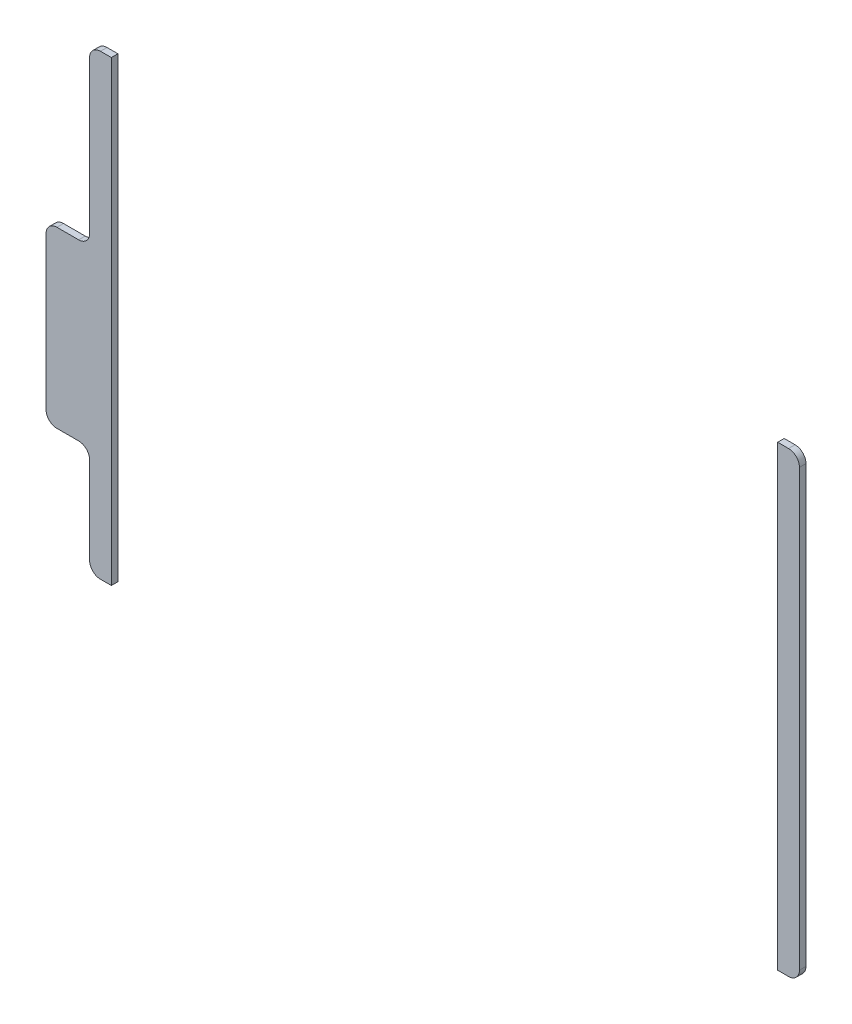
ISO-10303-21;
HEADER;
FILE_DESCRIPTION(('STEP AP214'),'2;1');
FILE_NAME('part.step','',(''),(''),'','','');
FILE_SCHEMA(('AUTOMOTIVE_DESIGN { 1 0 10303 214 1 1 1 1 }'));
ENDSEC;
DATA;
#1=APPLICATION_CONTEXT('core data for automotive mechanical design processes');
#2=APPLICATION_PROTOCOL_DEFINITION('international standard','automotive_design',2000,#1);
#3=PRODUCT_CONTEXT('',#1,'mechanical');
#4=PRODUCT('Part','Part','',(#3));
#5=PRODUCT_RELATED_PRODUCT_CATEGORY('part','',(#4));
#6=PRODUCT_DEFINITION_FORMATION('','',#4);
#7=PRODUCT_DEFINITION_CONTEXT('part definition',#1,'design');
#8=PRODUCT_DEFINITION('design','',#6,#7);
#9=PRODUCT_DEFINITION_SHAPE('','',#8);
#10=(LENGTH_UNIT() NAMED_UNIT(*) SI_UNIT(.MILLI.,.METRE.));
#11=(NAMED_UNIT(*) PLANE_ANGLE_UNIT() SI_UNIT($,.RADIAN.));
#12=(NAMED_UNIT(*) SI_UNIT($,.STERADIAN.) SOLID_ANGLE_UNIT());
#13=UNCERTAINTY_MEASURE_WITH_UNIT(LENGTH_MEASURE(1.E-05),#10,'distance_accuracy_value','');
#14=(GEOMETRIC_REPRESENTATION_CONTEXT(3) GLOBAL_UNCERTAINTY_ASSIGNED_CONTEXT((#13)) GLOBAL_UNIT_ASSIGNED_CONTEXT((#10,
#11,#12)) REPRESENTATION_CONTEXT('',''));
#15=CARTESIAN_POINT('',(0.,0.,0.));
#16=DIRECTION('',(0.,0.,1.));
#17=DIRECTION('',(1.,0.,0.));
#18=AXIS2_PLACEMENT_3D('',#15,#16,#17);
#19=CARTESIAN_POINT('',(-30.6,21.,0.6));
#20=DIRECTION('',(0.,-1.,0.));
#21=DIRECTION('',(0.,0.,-1.));
#22=AXIS2_PLACEMENT_3D('',#19,#20,#21);
#23=PLANE('',#22);
#24=DIRECTION('',(-1.,0.,0.));
#25=VECTOR('',#24,1.);
#26=CARTESIAN_POINT('',(-30.6,21.,0.));
#27=LINE('',#26,#25);
#28=CARTESIAN_POINT('',(-30.6,21.,0.));
#29=VERTEX_POINT('',#28);
#30=CARTESIAN_POINT('',(-31.6,21.,0.));
#31=VERTEX_POINT('',#30);
#32=EDGE_CURVE('E177',#29,#31,#27,.T.);
#33=ORIENTED_EDGE('',*,*,#32,.T.);
#34=DIRECTION('',(0.,0.,-1.));
#35=VECTOR('',#34,1.);
#36=CARTESIAN_POINT('',(-31.6,21.,0.6));
#37=LINE('',#36,#35);
#38=CARTESIAN_POINT('',(-31.6,21.,0.6));
#39=VERTEX_POINT('',#38);
#40=EDGE_CURVE('E12',#39,#31,#37,.T.);
#41=ORIENTED_EDGE('',*,*,#40,.F.);
#42=DIRECTION('',(-1.,0.,0.));
#43=VECTOR('',#42,1.);
#44=CARTESIAN_POINT('',(-30.6,21.,0.6));
#45=LINE('',#44,#43);
#46=CARTESIAN_POINT('',(-30.6,21.,0.6));
#47=VERTEX_POINT('',#46);
#48=EDGE_CURVE('E203',#47,#39,#45,.T.);
#49=ORIENTED_EDGE('',*,*,#48,.F.);
#50=DIRECTION('',(0.,0.,-1.));
#51=VECTOR('',#50,1.);
#52=CARTESIAN_POINT('',(-30.6,21.,0.6));
#53=LINE('',#52,#51);
#54=EDGE_CURVE('E173',#47,#29,#53,.T.);
#55=ORIENTED_EDGE('',*,*,#54,.T.);
#56=EDGE_LOOP('',(#33,#41,#49,#55));
#57=FACE_BOUND('',#56,.T.);
#58=ADVANCED_FACE('F45',(#57),#23,.F.);
#59=CARTESIAN_POINT('',(-31.6,20.,0.6));
#60=DIRECTION('',(0.,0.,-1.));
#61=DIRECTION('',(-1.,0.,0.));
#62=AXIS2_PLACEMENT_3D('',#59,#60,#61);
#63=CYLINDRICAL_SURFACE('',#62,1.);
#64=CARTESIAN_POINT('',(-31.6,20.,0.));
#65=DIRECTION('',(0.,0.,1.));
#66=DIRECTION('',(1.,0.,0.));
#67=AXIS2_PLACEMENT_3D('',#64,#65,#66);
#68=CIRCLE('',#67,1.);
#69=CARTESIAN_POINT('',(-32.6,20.,0.));
#70=VERTEX_POINT('',#69);
#71=EDGE_CURVE('E180',#31,#70,#68,.T.);
#72=ORIENTED_EDGE('',*,*,#71,.T.);
#73=DIRECTION('',(0.,0.,-1.));
#74=VECTOR('',#73,1.);
#75=CARTESIAN_POINT('',(-32.6,20.,0.6));
#76=LINE('',#75,#74);
#77=CARTESIAN_POINT('',(-32.6,20.,0.6));
#78=VERTEX_POINT('',#77);
#79=EDGE_CURVE('E53',#78,#70,#76,.T.);
#80=ORIENTED_EDGE('',*,*,#79,.F.);
#81=CARTESIAN_POINT('',(-31.6,20.,0.6));
#82=DIRECTION('',(0.,0.,1.));
#83=DIRECTION('',(1.,0.,0.));
#84=AXIS2_PLACEMENT_3D('',#81,#82,#83);
#85=CIRCLE('',#84,1.);
#86=EDGE_CURVE('E122',#39,#78,#85,.T.);
#87=ORIENTED_EDGE('',*,*,#86,.F.);
#88=ORIENTED_EDGE('',*,*,#40,.T.);
#89=EDGE_LOOP('',(#72,#80,#87,#88));
#90=FACE_BOUND('',#89,.T.);
#91=ADVANCED_FACE('F291',(#90),#63,.T.);
#92=CARTESIAN_POINT('',(-32.6,6.,0.6));
#93=DIRECTION('',(1.,0.,0.));
#94=DIRECTION('',(0.,0.,-1.));
#95=AXIS2_PLACEMENT_3D('',#92,#93,#94);
#96=PLANE('',#95);
#97=DIRECTION('',(0.,-1.,0.));
#98=VECTOR('',#97,1.);
#99=CARTESIAN_POINT('',(-32.6,6.,0.));
#100=LINE('',#99,#98);
#101=CARTESIAN_POINT('',(-32.6,6.,0.));
#102=VERTEX_POINT('',#101);
#103=EDGE_CURVE('E182',#70,#102,#100,.T.);
#104=ORIENTED_EDGE('',*,*,#103,.T.);
#105=DIRECTION('',(0.,0.,-1.));
#106=VECTOR('',#105,1.);
#107=CARTESIAN_POINT('',(-32.6,6.,0.6));
#108=LINE('',#107,#106);
#109=CARTESIAN_POINT('',(-32.6,6.,0.6));
#110=VERTEX_POINT('',#109);
#111=EDGE_CURVE('E228',#110,#102,#108,.T.);
#112=ORIENTED_EDGE('',*,*,#111,.F.);
#113=DIRECTION('',(0.,-1.,0.));
#114=VECTOR('',#113,1.);
#115=CARTESIAN_POINT('',(-32.6,6.,0.6));
#116=LINE('',#115,#114);
#117=EDGE_CURVE('E236',#78,#110,#116,.T.);
#118=ORIENTED_EDGE('',*,*,#117,.F.);
#119=ORIENTED_EDGE('',*,*,#79,.T.);
#120=EDGE_LOOP('',(#104,#112,#118,#119));
#121=FACE_BOUND('',#120,.T.);
#122=ADVANCED_FACE('F234',(#121),#96,.F.);
#123=CARTESIAN_POINT('',(-33.6,6.,0.6));
#124=DIRECTION('',(0.,0.,-1.));
#125=DIRECTION('',(-1.,0.,0.));
#126=AXIS2_PLACEMENT_3D('',#123,#124,#125);
#127=CYLINDRICAL_SURFACE('',#126,1.);
#128=CARTESIAN_POINT('',(-33.6,6.,0.));
#129=DIRECTION('',(0.,0.,-1.));
#130=DIRECTION('',(1.,0.,0.));
#131=AXIS2_PLACEMENT_3D('',#128,#129,#130);
#132=CIRCLE('',#131,1.);
#133=CARTESIAN_POINT('',(-33.6,5.,0.));
#134=VERTEX_POINT('',#133);
#135=EDGE_CURVE('E184',#102,#134,#132,.T.);
#136=ORIENTED_EDGE('',*,*,#135,.T.);
#137=DIRECTION('',(0.,0.,-1.));
#138=VECTOR('',#137,1.);
#139=CARTESIAN_POINT('',(-33.6,5.,0.6));
#140=LINE('',#139,#138);
#141=CARTESIAN_POINT('',(-33.6,5.,0.6));
#142=VERTEX_POINT('',#141);
#143=EDGE_CURVE('E225',#142,#134,#140,.T.);
#144=ORIENTED_EDGE('',*,*,#143,.F.);
#145=CARTESIAN_POINT('',(-33.6,6.,0.6));
#146=DIRECTION('',(0.,0.,-1.));
#147=DIRECTION('',(1.,0.,0.));
#148=AXIS2_PLACEMENT_3D('',#145,#146,#147);
#149=CIRCLE('',#148,1.);
#150=EDGE_CURVE('E254',#110,#142,#149,.T.);
#151=ORIENTED_EDGE('',*,*,#150,.F.);
#152=ORIENTED_EDGE('',*,*,#111,.T.);
#153=EDGE_LOOP('',(#136,#144,#151,#152));
#154=FACE_BOUND('',#153,.T.);
#155=ADVANCED_FACE('F245',(#154),#127,.F.);
#156=CARTESIAN_POINT('',(-35.6,5.,0.6));
#157=DIRECTION('',(0.,-1.,0.));
#158=DIRECTION('',(0.,0.,-1.));
#159=AXIS2_PLACEMENT_3D('',#156,#157,#158);
#160=PLANE('',#159);
#161=DIRECTION('',(-1.,0.,0.));
#162=VECTOR('',#161,1.);
#163=CARTESIAN_POINT('',(-35.6,5.,0.));
#164=LINE('',#163,#162);
#165=CARTESIAN_POINT('',(-35.6,5.,0.));
#166=VERTEX_POINT('',#165);
#167=EDGE_CURVE('E186',#134,#166,#164,.T.);
#168=ORIENTED_EDGE('',*,*,#167,.T.);
#169=DIRECTION('',(0.,0.,-1.));
#170=VECTOR('',#169,1.);
#171=CARTESIAN_POINT('',(-35.6,5.,0.6));
#172=LINE('',#171,#170);
#173=CARTESIAN_POINT('',(-35.6,5.,0.6));
#174=VERTEX_POINT('',#173);
#175=EDGE_CURVE('E222',#174,#166,#172,.T.);
#176=ORIENTED_EDGE('',*,*,#175,.F.);
#177=DIRECTION('',(-1.,0.,0.));
#178=VECTOR('',#177,1.);
#179=CARTESIAN_POINT('',(-35.6,5.,0.6));
#180=LINE('',#179,#178);
#181=EDGE_CURVE('E251',#142,#174,#180,.T.);
#182=ORIENTED_EDGE('',*,*,#181,.F.);
#183=ORIENTED_EDGE('',*,*,#143,.T.);
#184=EDGE_LOOP('',(#168,#176,#182,#183));
#185=FACE_BOUND('',#184,.T.);
#186=ADVANCED_FACE('F249',(#185),#160,.F.);
#187=CARTESIAN_POINT('',(-35.6,4.,0.6));
#188=DIRECTION('',(0.,0.,-1.));
#189=DIRECTION('',(-1.,0.,0.));
#190=AXIS2_PLACEMENT_3D('',#187,#188,#189);
#191=CYLINDRICAL_SURFACE('',#190,1.);
#192=CARTESIAN_POINT('',(-35.6,4.,0.));
#193=DIRECTION('',(0.,0.,1.));
#194=DIRECTION('',(-1.,0.,0.));
#195=AXIS2_PLACEMENT_3D('',#192,#193,#194);
#196=CIRCLE('',#195,1.);
#197=CARTESIAN_POINT('',(-36.6,3.99999999999999,0.));
#198=VERTEX_POINT('',#197);
#199=EDGE_CURVE('E188',#166,#198,#196,.T.);
#200=ORIENTED_EDGE('',*,*,#199,.T.);
#201=DIRECTION('',(0.,0.,-1.));
#202=VECTOR('',#201,1.);
#203=CARTESIAN_POINT('',(-36.6,3.99999999999999,0.6));
#204=LINE('',#203,#202);
#205=CARTESIAN_POINT('',(-36.6,3.99999999999999,0.6));
#206=VERTEX_POINT('',#205);
#207=EDGE_CURVE('E219',#206,#198,#204,.T.);
#208=ORIENTED_EDGE('',*,*,#207,.F.);
#209=CARTESIAN_POINT('',(-35.6,4.,0.6));
#210=DIRECTION('',(0.,0.,1.));
#211=DIRECTION('',(-1.,0.,0.));
#212=AXIS2_PLACEMENT_3D('',#209,#210,#211);
#213=CIRCLE('',#212,1.);
#214=EDGE_CURVE('E253',#174,#206,#213,.T.);
#215=ORIENTED_EDGE('',*,*,#214,.F.);
#216=ORIENTED_EDGE('',*,*,#175,.T.);
#217=EDGE_LOOP('',(#200,#208,#215,#216));
#218=FACE_BOUND('',#217,.T.);
#219=ADVANCED_FACE('F304',(#218),#191,.T.);
#220=CARTESIAN_POINT('',(-36.6,-9.99999999999999,0.6));
#221=DIRECTION('',(1.,0.,0.));
#222=DIRECTION('',(0.,0.,-1.));
#223=AXIS2_PLACEMENT_3D('',#220,#221,#222);
#224=PLANE('',#223);
#225=DIRECTION('',(0.,-1.,0.));
#226=VECTOR('',#225,1.);
#227=CARTESIAN_POINT('',(-36.6,-9.99999999999999,0.));
#228=LINE('',#227,#226);
#229=CARTESIAN_POINT('',(-36.6,-10.,0.));
#230=VERTEX_POINT('',#229);
#231=EDGE_CURVE('E190',#198,#230,#228,.T.);
#232=ORIENTED_EDGE('',*,*,#231,.T.);
#233=DIRECTION('',(0.,0.,-1.));
#234=VECTOR('',#233,1.);
#235=CARTESIAN_POINT('',(-36.6,-10.,0.6));
#236=LINE('',#235,#234);
#237=CARTESIAN_POINT('',(-36.6,-10.,0.6));
#238=VERTEX_POINT('',#237);
#239=EDGE_CURVE('E216',#238,#230,#236,.T.);
#240=ORIENTED_EDGE('',*,*,#239,.F.);
#241=DIRECTION('',(0.,-1.,0.));
#242=VECTOR('',#241,1.);
#243=CARTESIAN_POINT('',(-36.6,-9.99999999999999,0.6));
#244=LINE('',#243,#242);
#245=EDGE_CURVE('E256',#206,#238,#244,.T.);
#246=ORIENTED_EDGE('',*,*,#245,.F.);
#247=ORIENTED_EDGE('',*,*,#207,.T.);
#248=EDGE_LOOP('',(#232,#240,#246,#247));
#249=FACE_BOUND('',#248,.T.);
#250=ADVANCED_FACE('F307',(#249),#224,.F.);
#251=CARTESIAN_POINT('',(-35.6,-10.,0.6));
#252=DIRECTION('',(0.,0.,-1.));
#253=DIRECTION('',(-1.,0.,0.));
#254=AXIS2_PLACEMENT_3D('',#251,#252,#253);
#255=CYLINDRICAL_SURFACE('',#254,1.);
#256=CARTESIAN_POINT('',(-35.6,-10.,0.));
#257=DIRECTION('',(0.,0.,1.));
#258=DIRECTION('',(-1.,0.,0.));
#259=AXIS2_PLACEMENT_3D('',#256,#257,#258);
#260=CIRCLE('',#259,1.);
#261=CARTESIAN_POINT('',(-35.6,-11.,0.));
#262=VERTEX_POINT('',#261);
#263=EDGE_CURVE('E192',#230,#262,#260,.T.);
#264=ORIENTED_EDGE('',*,*,#263,.T.);
#265=DIRECTION('',(0.,0.,-1.));
#266=VECTOR('',#265,1.);
#267=CARTESIAN_POINT('',(-35.6,-11.,0.6));
#268=LINE('',#267,#266);
#269=CARTESIAN_POINT('',(-35.6,-11.,0.6));
#270=VERTEX_POINT('',#269);
#271=EDGE_CURVE('E213',#270,#262,#268,.T.);
#272=ORIENTED_EDGE('',*,*,#271,.F.);
#273=CARTESIAN_POINT('',(-35.6,-10.,0.6));
#274=DIRECTION('',(0.,0.,1.));
#275=DIRECTION('',(-1.,0.,0.));
#276=AXIS2_PLACEMENT_3D('',#273,#274,#275);
#277=CIRCLE('',#276,1.);
#278=EDGE_CURVE('E262',#238,#270,#277,.T.);
#279=ORIENTED_EDGE('',*,*,#278,.F.);
#280=ORIENTED_EDGE('',*,*,#239,.T.);
#281=EDGE_LOOP('',(#264,#272,#279,#280));
#282=FACE_BOUND('',#281,.T.);
#283=ADVANCED_FACE('F311',(#282),#255,.T.);
#284=CARTESIAN_POINT('',(-33.6,-11.,0.6));
#285=DIRECTION('',(0.,1.,0.));
#286=DIRECTION('',(0.,0.,1.));
#287=AXIS2_PLACEMENT_3D('',#284,#285,#286);
#288=PLANE('',#287);
#289=DIRECTION('',(1.,0.,0.));
#290=VECTOR('',#289,1.);
#291=CARTESIAN_POINT('',(-33.6,-11.,0.));
#292=LINE('',#291,#290);
#293=CARTESIAN_POINT('',(-33.6,-11.,0.));
#294=VERTEX_POINT('',#293);
#295=EDGE_CURVE('E194',#262,#294,#292,.T.);
#296=ORIENTED_EDGE('',*,*,#295,.T.);
#297=DIRECTION('',(0.,0.,-1.));
#298=VECTOR('',#297,1.);
#299=CARTESIAN_POINT('',(-33.6,-11.,0.6));
#300=LINE('',#299,#298);
#301=CARTESIAN_POINT('',(-33.6,-11.,0.6));
#302=VERTEX_POINT('',#301);
#303=EDGE_CURVE('E210',#302,#294,#300,.T.);
#304=ORIENTED_EDGE('',*,*,#303,.F.);
#305=DIRECTION('',(1.,0.,0.));
#306=VECTOR('',#305,1.);
#307=CARTESIAN_POINT('',(-33.6,-11.,0.6));
#308=LINE('',#307,#306);
#309=EDGE_CURVE('E264',#270,#302,#308,.T.);
#310=ORIENTED_EDGE('',*,*,#309,.F.);
#311=ORIENTED_EDGE('',*,*,#271,.T.);
#312=EDGE_LOOP('',(#296,#304,#310,#311));
#313=FACE_BOUND('',#312,.T.);
#314=ADVANCED_FACE('F315',(#313),#288,.F.);
#315=CARTESIAN_POINT('',(-33.6,-12.,0.6));
#316=DIRECTION('',(0.,0.,-1.));
#317=DIRECTION('',(-1.,0.,0.));
#318=AXIS2_PLACEMENT_3D('',#315,#316,#317);
#319=CYLINDRICAL_SURFACE('',#318,1.);
#320=CARTESIAN_POINT('',(-33.6,-12.,0.));
#321=DIRECTION('',(0.,0.,-1.));
#322=DIRECTION('',(1.,0.,0.));
#323=AXIS2_PLACEMENT_3D('',#320,#321,#322);
#324=CIRCLE('',#323,1.);
#325=CARTESIAN_POINT('',(-32.6,-12.,0.));
#326=VERTEX_POINT('',#325);
#327=EDGE_CURVE('E196',#294,#326,#324,.T.);
#328=ORIENTED_EDGE('',*,*,#327,.T.);
#329=DIRECTION('',(0.,0.,-1.));
#330=VECTOR('',#329,1.);
#331=CARTESIAN_POINT('',(-32.6,-12.,0.6));
#332=LINE('',#331,#330);
#333=CARTESIAN_POINT('',(-32.6,-12.,0.6));
#334=VERTEX_POINT('',#333);
#335=EDGE_CURVE('E207',#334,#326,#332,.T.);
#336=ORIENTED_EDGE('',*,*,#335,.F.);
#337=CARTESIAN_POINT('',(-33.6,-12.,0.6));
#338=DIRECTION('',(0.,0.,-1.));
#339=DIRECTION('',(1.,0.,0.));
#340=AXIS2_PLACEMENT_3D('',#337,#338,#339);
#341=CIRCLE('',#340,1.);
#342=EDGE_CURVE('E266',#302,#334,#341,.T.);
#343=ORIENTED_EDGE('',*,*,#342,.F.);
#344=ORIENTED_EDGE('',*,*,#303,.T.);
#345=EDGE_LOOP('',(#328,#336,#343,#344));
#346=FACE_BOUND('',#345,.T.);
#347=ADVANCED_FACE('F272',(#346),#319,.F.);
#348=CARTESIAN_POINT('',(-32.6,-20.,0.6));
#349=DIRECTION('',(1.,0.,0.));
#350=DIRECTION('',(0.,0.,-1.));
#351=AXIS2_PLACEMENT_3D('',#348,#349,#350);
#352=PLANE('',#351);
#353=DIRECTION('',(0.,-1.,0.));
#354=VECTOR('',#353,1.);
#355=CARTESIAN_POINT('',(-32.6,-20.,0.));
#356=LINE('',#355,#354);
#357=CARTESIAN_POINT('',(-32.6,-20.,0.));
#358=VERTEX_POINT('',#357);
#359=EDGE_CURVE('E198',#326,#358,#356,.T.);
#360=ORIENTED_EDGE('',*,*,#359,.T.);
#361=DIRECTION('',(0.,0.,-1.));
#362=VECTOR('',#361,1.);
#363=CARTESIAN_POINT('',(-32.6,-20.,0.6));
#364=LINE('',#363,#362);
#365=CARTESIAN_POINT('',(-32.6,-20.,0.6));
#366=VERTEX_POINT('',#365);
#367=EDGE_CURVE('E168',#366,#358,#364,.T.);
#368=ORIENTED_EDGE('',*,*,#367,.F.);
#369=DIRECTION('',(0.,-1.,0.));
#370=VECTOR('',#369,1.);
#371=CARTESIAN_POINT('',(-32.6,-20.,0.6));
#372=LINE('',#371,#370);
#373=EDGE_CURVE('E159',#334,#366,#372,.T.);
#374=ORIENTED_EDGE('',*,*,#373,.F.);
#375=ORIENTED_EDGE('',*,*,#335,.T.);
#376=EDGE_LOOP('',(#360,#368,#374,#375));
#377=FACE_BOUND('',#376,.T.);
#378=ADVANCED_FACE('F276',(#377),#352,.F.);
#379=CARTESIAN_POINT('',(-31.6,-20.,0.6));
#380=DIRECTION('',(0.,0.,-1.));
#381=DIRECTION('',(-1.,0.,0.));
#382=AXIS2_PLACEMENT_3D('',#379,#380,#381);
#383=CYLINDRICAL_SURFACE('',#382,1.);
#384=CARTESIAN_POINT('',(-31.6,-20.,0.));
#385=DIRECTION('',(0.,0.,1.));
#386=DIRECTION('',(-1.,0.,0.));
#387=AXIS2_PLACEMENT_3D('',#384,#385,#386);
#388=CIRCLE('',#387,1.);
#389=CARTESIAN_POINT('',(-31.6,-21.,0.));
#390=VERTEX_POINT('',#389);
#391=EDGE_CURVE('E167',#358,#390,#388,.T.);
#392=ORIENTED_EDGE('',*,*,#391,.T.);
#393=DIRECTION('',(0.,0.,-1.));
#394=VECTOR('',#393,1.);
#395=CARTESIAN_POINT('',(-31.6,-21.,0.6));
#396=LINE('',#395,#394);
#397=CARTESIAN_POINT('',(-31.6,-21.,0.6));
#398=VERTEX_POINT('',#397);
#399=EDGE_CURVE('E164',#398,#390,#396,.T.);
#400=ORIENTED_EDGE('',*,*,#399,.F.);
#401=CARTESIAN_POINT('',(-31.6,-20.,0.6));
#402=DIRECTION('',(0.,0.,1.));
#403=DIRECTION('',(-1.,0.,0.));
#404=AXIS2_PLACEMENT_3D('',#401,#402,#403);
#405=CIRCLE('',#404,1.);
#406=EDGE_CURVE('E153',#366,#398,#405,.T.);
#407=ORIENTED_EDGE('',*,*,#406,.F.);
#408=ORIENTED_EDGE('',*,*,#367,.T.);
#409=EDGE_LOOP('',(#392,#400,#407,#408));
#410=FACE_BOUND('',#409,.T.);
#411=ADVANCED_FACE('F165',(#410),#383,.T.);
#412=CARTESIAN_POINT('',(-30.6,-21.,0.6));
#413=DIRECTION('',(0.,1.,0.));
#414=DIRECTION('',(0.,0.,1.));
#415=AXIS2_PLACEMENT_3D('',#412,#413,#414);
#416=PLANE('',#415);
#417=DIRECTION('',(1.,0.,0.));
#418=VECTOR('',#417,1.);
#419=CARTESIAN_POINT('',(-30.6,-21.,0.));
#420=LINE('',#419,#418);
#421=CARTESIAN_POINT('',(-30.6,-21.,0.));
#422=VERTEX_POINT('',#421);
#423=EDGE_CURVE('E108',#390,#422,#420,.T.);
#424=ORIENTED_EDGE('',*,*,#423,.T.);
#425=DIRECTION('',(0.,0.,-1.));
#426=VECTOR('',#425,1.);
#427=CARTESIAN_POINT('',(-30.6,-21.,0.6));
#428=LINE('',#427,#426);
#429=CARTESIAN_POINT('',(-30.6,-21.,0.6));
#430=VERTEX_POINT('',#429);
#431=EDGE_CURVE('E169',#430,#422,#428,.T.);
#432=ORIENTED_EDGE('',*,*,#431,.F.);
#433=DIRECTION('',(1.,0.,0.));
#434=VECTOR('',#433,1.);
#435=CARTESIAN_POINT('',(-30.6,-21.,0.6));
#436=LINE('',#435,#434);
#437=EDGE_CURVE('E157',#398,#430,#436,.T.);
#438=ORIENTED_EDGE('',*,*,#437,.F.);
#439=ORIENTED_EDGE('',*,*,#399,.T.);
#440=EDGE_LOOP('',(#424,#432,#438,#439));
#441=FACE_BOUND('',#440,.T.);
#442=ADVANCED_FACE('F171',(#441),#416,.F.);
#443=CARTESIAN_POINT('',(-30.6,21.,0.6));
#444=DIRECTION('',(-1.,0.,0.));
#445=DIRECTION('',(0.,-1.,0.));
#446=AXIS2_PLACEMENT_3D('',#443,#444,#445);
#447=PLANE('',#446);
#448=DIRECTION('',(0.,1.,0.));
#449=VECTOR('',#448,1.);
#450=CARTESIAN_POINT('',(-30.6,21.,0.));
#451=LINE('',#450,#449);
#452=EDGE_CURVE('E114',#422,#29,#451,.T.);
#453=ORIENTED_EDGE('',*,*,#452,.T.);
#454=ORIENTED_EDGE('',*,*,#54,.F.);
#455=DIRECTION('',(0.,1.,0.));
#456=VECTOR('',#455,1.);
#457=CARTESIAN_POINT('',(-30.6,21.,0.6));
#458=LINE('',#457,#456);
#459=EDGE_CURVE('E61',#430,#47,#458,.T.);
#460=ORIENTED_EDGE('',*,*,#459,.F.);
#461=ORIENTED_EDGE('',*,*,#431,.T.);
#462=EDGE_LOOP('',(#453,#454,#460,#461));
#463=FACE_BOUND('',#462,.T.);
#464=ADVANCED_FACE('F280',(#463),#447,.F.);
#465=CARTESIAN_POINT('',(-31.6,20.,0.6));
#466=DIRECTION('',(0.,0.,1.));
#467=DIRECTION('',(1.,0.,0.));
#468=AXIS2_PLACEMENT_3D('',#465,#466,#467);
#469=PLANE('',#468);
#470=ORIENTED_EDGE('',*,*,#48,.T.);
#471=ORIENTED_EDGE('',*,*,#86,.T.);
#472=ORIENTED_EDGE('',*,*,#117,.T.);
#473=ORIENTED_EDGE('',*,*,#150,.T.);
#474=ORIENTED_EDGE('',*,*,#181,.T.);
#475=ORIENTED_EDGE('',*,*,#214,.T.);
#476=ORIENTED_EDGE('',*,*,#245,.T.);
#477=ORIENTED_EDGE('',*,*,#278,.T.);
#478=ORIENTED_EDGE('',*,*,#309,.T.);
#479=ORIENTED_EDGE('',*,*,#342,.T.);
#480=ORIENTED_EDGE('',*,*,#373,.T.);
#481=ORIENTED_EDGE('',*,*,#406,.T.);
#482=ORIENTED_EDGE('',*,*,#437,.T.);
#483=ORIENTED_EDGE('',*,*,#459,.T.);
#484=EDGE_LOOP('',(#470,#471,#472,#473,#474,#475,#476,#477,#478,#479,#480,#481,#482,#483));
#485=FACE_BOUND('',#484,.T.);
#486=ADVANCED_FACE('F155',(#485),#469,.T.);
#487=CARTESIAN_POINT('',(-31.6,20.,0.));
#488=DIRECTION('',(0.,0.,1.));
#489=DIRECTION('',(1.,0.,0.));
#490=AXIS2_PLACEMENT_3D('',#487,#488,#489);
#491=PLANE('',#490);
#492=ORIENTED_EDGE('',*,*,#32,.F.);
#493=ORIENTED_EDGE('',*,*,#452,.F.);
#494=ORIENTED_EDGE('',*,*,#423,.F.);
#495=ORIENTED_EDGE('',*,*,#391,.F.);
#496=ORIENTED_EDGE('',*,*,#359,.F.);
#497=ORIENTED_EDGE('',*,*,#327,.F.);
#498=ORIENTED_EDGE('',*,*,#295,.F.);
#499=ORIENTED_EDGE('',*,*,#263,.F.);
#500=ORIENTED_EDGE('',*,*,#231,.F.);
#501=ORIENTED_EDGE('',*,*,#199,.F.);
#502=ORIENTED_EDGE('',*,*,#167,.F.);
#503=ORIENTED_EDGE('',*,*,#135,.F.);
#504=ORIENTED_EDGE('',*,*,#103,.F.);
#505=ORIENTED_EDGE('',*,*,#71,.F.);
#506=EDGE_LOOP('',(#492,#493,#494,#495,#496,#497,#498,#499,#500,#501,#502,#503,#504,#505));
#507=FACE_BOUND('',#506,.T.);
#508=ADVANCED_FACE('F240',(#507),#491,.F.);
#509=CLOSED_SHELL('',(#58,#91,#122,#155,#186,#219,#250,#283,#314,#347,#378,#411,#442,#464,#486,#508));
#510=MANIFOLD_SOLID_BREP('B2',#509);
#511=CARTESIAN_POINT('',(30.6,-21.,0.6));
#512=DIRECTION('',(0.,1.,0.));
#513=DIRECTION('',(0.,0.,1.));
#514=AXIS2_PLACEMENT_3D('',#511,#512,#513);
#515=PLANE('',#514);
#516=DIRECTION('',(1.,0.,0.));
#517=VECTOR('',#516,1.);
#518=CARTESIAN_POINT('',(30.6,-21.,0.));
#519=LINE('',#518,#517);
#520=CARTESIAN_POINT('',(30.6,-21.,0.));
#521=VERTEX_POINT('',#520);
#522=CARTESIAN_POINT('',(31.6,-21.,0.));
#523=VERTEX_POINT('',#522);
#524=EDGE_CURVE('E513',#521,#523,#519,.T.);
#525=ORIENTED_EDGE('',*,*,#524,.T.);
#526=DIRECTION('',(0.,0.,-1.));
#527=VECTOR('',#526,1.);
#528=CARTESIAN_POINT('',(31.6,-21.,0.6));
#529=LINE('',#528,#527);
#530=CARTESIAN_POINT('',(31.6,-21.,0.6));
#531=VERTEX_POINT('',#530);
#532=EDGE_CURVE('E43',#531,#523,#529,.T.);
#533=ORIENTED_EDGE('',*,*,#532,.F.);
#534=DIRECTION('',(1.,0.,0.));
#535=VECTOR('',#534,1.);
#536=CARTESIAN_POINT('',(30.6,-21.,0.6));
#537=LINE('',#536,#535);
#538=CARTESIAN_POINT('',(30.6,-21.,0.6));
#539=VERTEX_POINT('',#538);
#540=EDGE_CURVE('E523',#539,#531,#537,.T.);
#541=ORIENTED_EDGE('',*,*,#540,.F.);
#542=DIRECTION('',(0.,0.,-1.));
#543=VECTOR('',#542,1.);
#544=CARTESIAN_POINT('',(30.6,-21.,0.6));
#545=LINE('',#544,#543);
#546=EDGE_CURVE('E509',#539,#521,#545,.T.);
#547=ORIENTED_EDGE('',*,*,#546,.T.);
#548=EDGE_LOOP('',(#525,#533,#541,#547));
#549=FACE_BOUND('',#548,.T.);
#550=ADVANCED_FACE('F429',(#549),#515,.F.);
#551=CARTESIAN_POINT('',(31.6,-20.,0.6));
#552=DIRECTION('',(0.,0.,-1.));
#553=DIRECTION('',(-1.,0.,0.));
#554=AXIS2_PLACEMENT_3D('',#551,#552,#553);
#555=CYLINDRICAL_SURFACE('',#554,1.);
#556=CARTESIAN_POINT('',(31.6,-20.,0.));
#557=DIRECTION('',(0.,0.,1.));
#558=DIRECTION('',(1.,0.,0.));
#559=AXIS2_PLACEMENT_3D('',#556,#557,#558);
#560=CIRCLE('',#559,1.);
#561=CARTESIAN_POINT('',(32.6,-20.,0.));
#562=VERTEX_POINT('',#561);
#563=EDGE_CURVE('E516',#523,#562,#560,.T.);
#564=ORIENTED_EDGE('',*,*,#563,.T.);
#565=DIRECTION('',(0.,0.,-1.));
#566=VECTOR('',#565,1.);
#567=CARTESIAN_POINT('',(32.6,-20.,0.6));
#568=LINE('',#567,#566);
#569=CARTESIAN_POINT('',(32.6,-20.,0.6));
#570=VERTEX_POINT('',#569);
#571=EDGE_CURVE('E437',#570,#562,#568,.T.);
#572=ORIENTED_EDGE('',*,*,#571,.F.);
#573=CARTESIAN_POINT('',(31.6,-20.,0.6));
#574=DIRECTION('',(0.,0.,1.));
#575=DIRECTION('',(1.,0.,0.));
#576=AXIS2_PLACEMENT_3D('',#573,#574,#575);
#577=CIRCLE('',#576,1.);
#578=EDGE_CURVE('E482',#531,#570,#577,.T.);
#579=ORIENTED_EDGE('',*,*,#578,.F.);
#580=ORIENTED_EDGE('',*,*,#532,.T.);
#581=EDGE_LOOP('',(#564,#572,#579,#580));
#582=FACE_BOUND('',#581,.T.);
#583=ADVANCED_FACE('F547',(#582),#555,.T.);
#584=CARTESIAN_POINT('',(32.6,20.,0.6));
#585=DIRECTION('',(-1.,0.,0.));
#586=DIRECTION('',(0.,0.,1.));
#587=AXIS2_PLACEMENT_3D('',#584,#585,#586);
#588=PLANE('',#587);
#589=DIRECTION('',(0.,1.,0.));
#590=VECTOR('',#589,1.);
#591=CARTESIAN_POINT('',(32.6,20.,0.));
#592=LINE('',#591,#590);
#593=CARTESIAN_POINT('',(32.6,20.,0.));
#594=VERTEX_POINT('',#593);
#595=EDGE_CURVE('E518',#562,#594,#592,.T.);
#596=ORIENTED_EDGE('',*,*,#595,.T.);
#597=DIRECTION('',(0.,0.,-1.));
#598=VECTOR('',#597,1.);
#599=CARTESIAN_POINT('',(32.6,20.,0.6));
#600=LINE('',#599,#598);
#601=CARTESIAN_POINT('',(32.6,20.,0.6));
#602=VERTEX_POINT('',#601);
#603=EDGE_CURVE('E504',#602,#594,#600,.T.);
#604=ORIENTED_EDGE('',*,*,#603,.F.);
#605=DIRECTION('',(0.,1.,0.));
#606=VECTOR('',#605,1.);
#607=CARTESIAN_POINT('',(32.6,20.,0.6));
#608=LINE('',#607,#606);
#609=EDGE_CURVE('E495',#570,#602,#608,.T.);
#610=ORIENTED_EDGE('',*,*,#609,.F.);
#611=ORIENTED_EDGE('',*,*,#571,.T.);
#612=EDGE_LOOP('',(#596,#604,#610,#611));
#613=FACE_BOUND('',#612,.T.);
#614=ADVANCED_FACE('F529',(#613),#588,.F.);
#615=CARTESIAN_POINT('',(31.6,20.,0.6));
#616=DIRECTION('',(0.,0.,-1.));
#617=DIRECTION('',(-1.,0.,0.));
#618=AXIS2_PLACEMENT_3D('',#615,#616,#617);
#619=CYLINDRICAL_SURFACE('',#618,1.);
#620=CARTESIAN_POINT('',(31.6,20.,0.));
#621=DIRECTION('',(0.,0.,1.));
#622=DIRECTION('',(-1.,0.,0.));
#623=AXIS2_PLACEMENT_3D('',#620,#621,#622);
#624=CIRCLE('',#623,1.);
#625=CARTESIAN_POINT('',(31.6,21.,0.));
#626=VERTEX_POINT('',#625);
#627=EDGE_CURVE('E503',#594,#626,#624,.T.);
#628=ORIENTED_EDGE('',*,*,#627,.T.);
#629=DIRECTION('',(0.,0.,-1.));
#630=VECTOR('',#629,1.);
#631=CARTESIAN_POINT('',(31.6,21.,0.6));
#632=LINE('',#631,#630);
#633=CARTESIAN_POINT('',(31.6,21.,0.6));
#634=VERTEX_POINT('',#633);
#635=EDGE_CURVE('E500',#634,#626,#632,.T.);
#636=ORIENTED_EDGE('',*,*,#635,.F.);
#637=CARTESIAN_POINT('',(31.6,20.,0.6));
#638=DIRECTION('',(0.,0.,1.));
#639=DIRECTION('',(-1.,0.,0.));
#640=AXIS2_PLACEMENT_3D('',#637,#638,#639);
#641=CIRCLE('',#640,1.);
#642=EDGE_CURVE('E489',#602,#634,#641,.T.);
#643=ORIENTED_EDGE('',*,*,#642,.F.);
#644=ORIENTED_EDGE('',*,*,#603,.T.);
#645=EDGE_LOOP('',(#628,#636,#643,#644));
#646=FACE_BOUND('',#645,.T.);
#647=ADVANCED_FACE('F501',(#646),#619,.T.);
#648=CARTESIAN_POINT('',(30.6,21.,0.6));
#649=DIRECTION('',(0.,-1.,0.));
#650=DIRECTION('',(0.,0.,-1.));
#651=AXIS2_PLACEMENT_3D('',#648,#649,#650);
#652=PLANE('',#651);
#653=DIRECTION('',(-1.,0.,0.));
#654=VECTOR('',#653,1.);
#655=CARTESIAN_POINT('',(30.6,21.,0.));
#656=LINE('',#655,#654);
#657=CARTESIAN_POINT('',(30.6,21.,0.));
#658=VERTEX_POINT('',#657);
#659=EDGE_CURVE('E468',#626,#658,#656,.T.);
#660=ORIENTED_EDGE('',*,*,#659,.T.);
#661=DIRECTION('',(0.,0.,-1.));
#662=VECTOR('',#661,1.);
#663=CARTESIAN_POINT('',(30.6,21.,0.6));
#664=LINE('',#663,#662);
#665=CARTESIAN_POINT('',(30.6,21.,0.6));
#666=VERTEX_POINT('',#665);
#667=EDGE_CURVE('E505',#666,#658,#664,.T.);
#668=ORIENTED_EDGE('',*,*,#667,.F.);
#669=DIRECTION('',(-1.,0.,0.));
#670=VECTOR('',#669,1.);
#671=CARTESIAN_POINT('',(30.6,21.,0.6));
#672=LINE('',#671,#670);
#673=EDGE_CURVE('E493',#634,#666,#672,.T.);
#674=ORIENTED_EDGE('',*,*,#673,.F.);
#675=ORIENTED_EDGE('',*,*,#635,.T.);
#676=EDGE_LOOP('',(#660,#668,#674,#675));
#677=FACE_BOUND('',#676,.T.);
#678=ADVANCED_FACE('F507',(#677),#652,.F.);
#679=CARTESIAN_POINT('',(30.6,21.,0.6));
#680=DIRECTION('',(1.,0.,0.));
#681=DIRECTION('',(0.,1.,0.));
#682=AXIS2_PLACEMENT_3D('',#679,#680,#681);
#683=PLANE('',#682);
#684=DIRECTION('',(0.,-1.,0.));
#685=VECTOR('',#684,1.);
#686=CARTESIAN_POINT('',(30.6,21.,0.));
#687=LINE('',#686,#685);
#688=EDGE_CURVE('E474',#658,#521,#687,.T.);
#689=ORIENTED_EDGE('',*,*,#688,.T.);
#690=ORIENTED_EDGE('',*,*,#546,.F.);
#691=DIRECTION('',(0.,-1.,0.));
#692=VECTOR('',#691,1.);
#693=CARTESIAN_POINT('',(30.6,21.,0.6));
#694=LINE('',#693,#692);
#695=EDGE_CURVE('E445',#666,#539,#694,.T.);
#696=ORIENTED_EDGE('',*,*,#695,.F.);
#697=ORIENTED_EDGE('',*,*,#667,.T.);
#698=EDGE_LOOP('',(#689,#690,#696,#697));
#699=FACE_BOUND('',#698,.T.);
#700=ADVANCED_FACE('F536',(#699),#683,.F.);
#701=CARTESIAN_POINT('',(31.6,-20.,0.6));
#702=DIRECTION('',(0.,0.,1.));
#703=DIRECTION('',(1.,0.,0.));
#704=AXIS2_PLACEMENT_3D('',#701,#702,#703);
#705=PLANE('',#704);
#706=ORIENTED_EDGE('',*,*,#540,.T.);
#707=ORIENTED_EDGE('',*,*,#578,.T.);
#708=ORIENTED_EDGE('',*,*,#609,.T.);
#709=ORIENTED_EDGE('',*,*,#642,.T.);
#710=ORIENTED_EDGE('',*,*,#673,.T.);
#711=ORIENTED_EDGE('',*,*,#695,.T.);
#712=EDGE_LOOP('',(#706,#707,#708,#709,#710,#711));
#713=FACE_BOUND('',#712,.T.);
#714=ADVANCED_FACE('F491',(#713),#705,.T.);
#715=CARTESIAN_POINT('',(31.6,-20.,0.));
#716=DIRECTION('',(0.,0.,1.));
#717=DIRECTION('',(1.,0.,0.));
#718=AXIS2_PLACEMENT_3D('',#715,#716,#717);
#719=PLANE('',#718);
#720=ORIENTED_EDGE('',*,*,#524,.F.);
#721=ORIENTED_EDGE('',*,*,#688,.F.);
#722=ORIENTED_EDGE('',*,*,#659,.F.);
#723=ORIENTED_EDGE('',*,*,#627,.F.);
#724=ORIENTED_EDGE('',*,*,#595,.F.);
#725=ORIENTED_EDGE('',*,*,#563,.F.);
#726=EDGE_LOOP('',(#720,#721,#722,#723,#724,#725));
#727=FACE_BOUND('',#726,.T.);
#728=ADVANCED_FACE('F532',(#727),#719,.F.);
#729=CLOSED_SHELL('',(#550,#583,#614,#647,#678,#700,#714,#728));
#730=MANIFOLD_SOLID_BREP('B6',#729);
#731=ADVANCED_BREP_SHAPE_REPRESENTATION('',(#18,#510,#730),#14);
#732=SHAPE_DEFINITION_REPRESENTATION(#9,#731);
ENDSEC;
END-ISO-10303-21;
